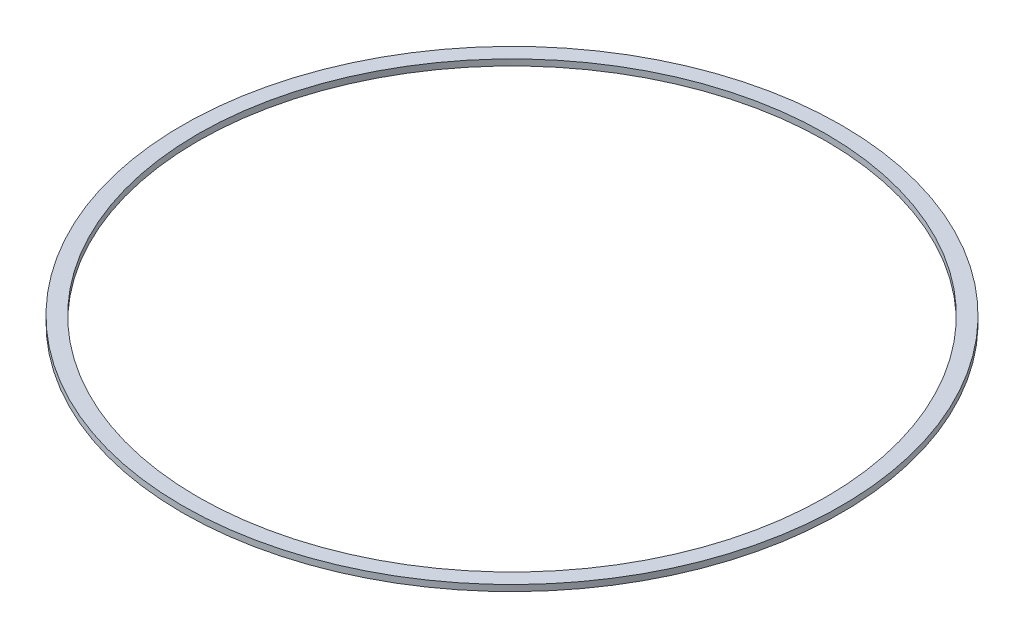
ISO-10303-21;
HEADER;
FILE_DESCRIPTION(('STEP AP214'),'2;1');
FILE_NAME('part.step','',(''),(''),'','','');
FILE_SCHEMA(('AUTOMOTIVE_DESIGN { 1 0 10303 214 1 1 1 1 }'));
ENDSEC;
DATA;
#1=APPLICATION_CONTEXT('core data for automotive mechanical design processes');
#2=APPLICATION_PROTOCOL_DEFINITION('international standard','automotive_design',2000,#1);
#3=PRODUCT_CONTEXT('',#1,'mechanical');
#4=PRODUCT('Part','Part','',(#3));
#5=PRODUCT_RELATED_PRODUCT_CATEGORY('part','',(#4));
#6=PRODUCT_DEFINITION_FORMATION('','',#4);
#7=PRODUCT_DEFINITION_CONTEXT('part definition',#1,'design');
#8=PRODUCT_DEFINITION('design','',#6,#7);
#9=PRODUCT_DEFINITION_SHAPE('','',#8);
#10=(LENGTH_UNIT() NAMED_UNIT(*) SI_UNIT(.MILLI.,.METRE.));
#11=(NAMED_UNIT(*) PLANE_ANGLE_UNIT() SI_UNIT($,.RADIAN.));
#12=(NAMED_UNIT(*) SI_UNIT($,.STERADIAN.) SOLID_ANGLE_UNIT());
#13=UNCERTAINTY_MEASURE_WITH_UNIT(LENGTH_MEASURE(1.E-05),#10,'distance_accuracy_value','');
#14=(GEOMETRIC_REPRESENTATION_CONTEXT(3) GLOBAL_UNCERTAINTY_ASSIGNED_CONTEXT((#13)) GLOBAL_UNIT_ASSIGNED_CONTEXT((#10,
#11,#12)) REPRESENTATION_CONTEXT('',''));
#15=CARTESIAN_POINT('',(0.,0.,0.));
#16=DIRECTION('',(0.,0.,1.));
#17=DIRECTION('',(1.,0.,0.));
#18=AXIS2_PLACEMENT_3D('',#15,#16,#17);
#19=CARTESIAN_POINT('',(0.,2.54,0.));
#20=DIRECTION('',(0.,1.,0.));
#21=DIRECTION('',(0.,0.,1.));
#22=AXIS2_PLACEMENT_3D('',#19,#20,#21);
#23=PLANE('',#22);
#24=CARTESIAN_POINT('',(0.,2.54,0.));
#25=DIRECTION('',(0.,1.,0.));
#26=DIRECTION('',(0.,0.,1.));
#27=AXIS2_PLACEMENT_3D('',#24,#25,#26);
#28=CIRCLE('',#27,136.525);
#29=CARTESIAN_POINT('',(0.,2.54,136.525));
#30=VERTEX_POINT('',#29);
#31=EDGE_CURVE('E10',#30,#30,#28,.T.);
#32=ORIENTED_EDGE('',*,*,#31,.T.);
#33=EDGE_LOOP('',(#32));
#34=FACE_BOUND('',#33,.T.);
#35=CARTESIAN_POINT('',(0.,2.54,0.));
#36=DIRECTION('',(0.,1.,0.));
#37=DIRECTION('',(0.,0.,1.));
#38=AXIS2_PLACEMENT_3D('',#35,#36,#37);
#39=CIRCLE('',#38,130.175);
#40=CARTESIAN_POINT('',(0.,2.54,130.175));
#41=VERTEX_POINT('',#40);
#42=EDGE_CURVE('E50',#41,#41,#39,.T.);
#43=ORIENTED_EDGE('',*,*,#42,.F.);
#44=EDGE_LOOP('',(#43));
#45=FACE_BOUND('',#44,.T.);
#46=ADVANCED_FACE('F39',(#34,#45),#23,.T.);
#47=CARTESIAN_POINT('',(0.,0.,0.));
#48=DIRECTION('',(0.,1.,0.));
#49=DIRECTION('',(0.,0.,1.));
#50=AXIS2_PLACEMENT_3D('',#47,#48,#49);
#51=PLANE('',#50);
#52=CARTESIAN_POINT('',(0.,0.,0.));
#53=DIRECTION('',(0.,1.,0.));
#54=DIRECTION('',(0.,0.,1.));
#55=AXIS2_PLACEMENT_3D('',#52,#53,#54);
#56=CIRCLE('',#55,136.525);
#57=CARTESIAN_POINT('',(0.,0.,136.525));
#58=VERTEX_POINT('',#57);
#59=EDGE_CURVE('E43',#58,#58,#56,.T.);
#60=ORIENTED_EDGE('',*,*,#59,.F.);
#61=EDGE_LOOP('',(#60));
#62=FACE_BOUND('',#61,.T.);
#63=CARTESIAN_POINT('',(0.,0.,0.));
#64=DIRECTION('',(0.,1.,0.));
#65=DIRECTION('',(0.,0.,1.));
#66=AXIS2_PLACEMENT_3D('',#63,#64,#65);
#67=CIRCLE('',#66,130.175);
#68=CARTESIAN_POINT('',(0.,0.,130.175));
#69=VERTEX_POINT('',#68);
#70=EDGE_CURVE('E52',#69,#69,#67,.T.);
#71=ORIENTED_EDGE('',*,*,#70,.T.);
#72=EDGE_LOOP('',(#71));
#73=FACE_BOUND('',#72,.T.);
#74=ADVANCED_FACE('F62',(#62,#73),#51,.F.);
#75=CARTESIAN_POINT('',(0.,2.54,0.));
#76=DIRECTION('',(0.,-1.,0.));
#77=DIRECTION('',(0.,0.,-1.));
#78=AXIS2_PLACEMENT_3D('',#75,#76,#77);
#79=CYLINDRICAL_SURFACE('',#78,136.525);
#80=ORIENTED_EDGE('',*,*,#31,.F.);
#81=EDGE_LOOP('',(#80));
#82=FACE_BOUND('',#81,.T.);
#83=ORIENTED_EDGE('',*,*,#59,.T.);
#84=EDGE_LOOP('',(#83));
#85=FACE_BOUND('',#84,.T.);
#86=ADVANCED_FACE('F41',(#82,#85),#79,.T.);
#87=CARTESIAN_POINT('',(0.,2.54,0.));
#88=DIRECTION('',(0.,-1.,0.));
#89=DIRECTION('',(0.,0.,-1.));
#90=AXIS2_PLACEMENT_3D('',#87,#88,#89);
#91=CYLINDRICAL_SURFACE('',#90,130.175);
#92=ORIENTED_EDGE('',*,*,#42,.T.);
#93=EDGE_LOOP('',(#92));
#94=FACE_BOUND('',#93,.T.);
#95=ORIENTED_EDGE('',*,*,#70,.F.);
#96=EDGE_LOOP('',(#95));
#97=FACE_BOUND('',#96,.T.);
#98=ADVANCED_FACE('F58',(#94,#97),#91,.F.);
#99=CLOSED_SHELL('',(#46,#74,#86,#98));
#100=MANIFOLD_SOLID_BREP('B2',#99);
#101=ADVANCED_BREP_SHAPE_REPRESENTATION('',(#18,#100),#14);
#102=SHAPE_DEFINITION_REPRESENTATION(#9,#101);
ENDSEC;
END-ISO-10303-21;
